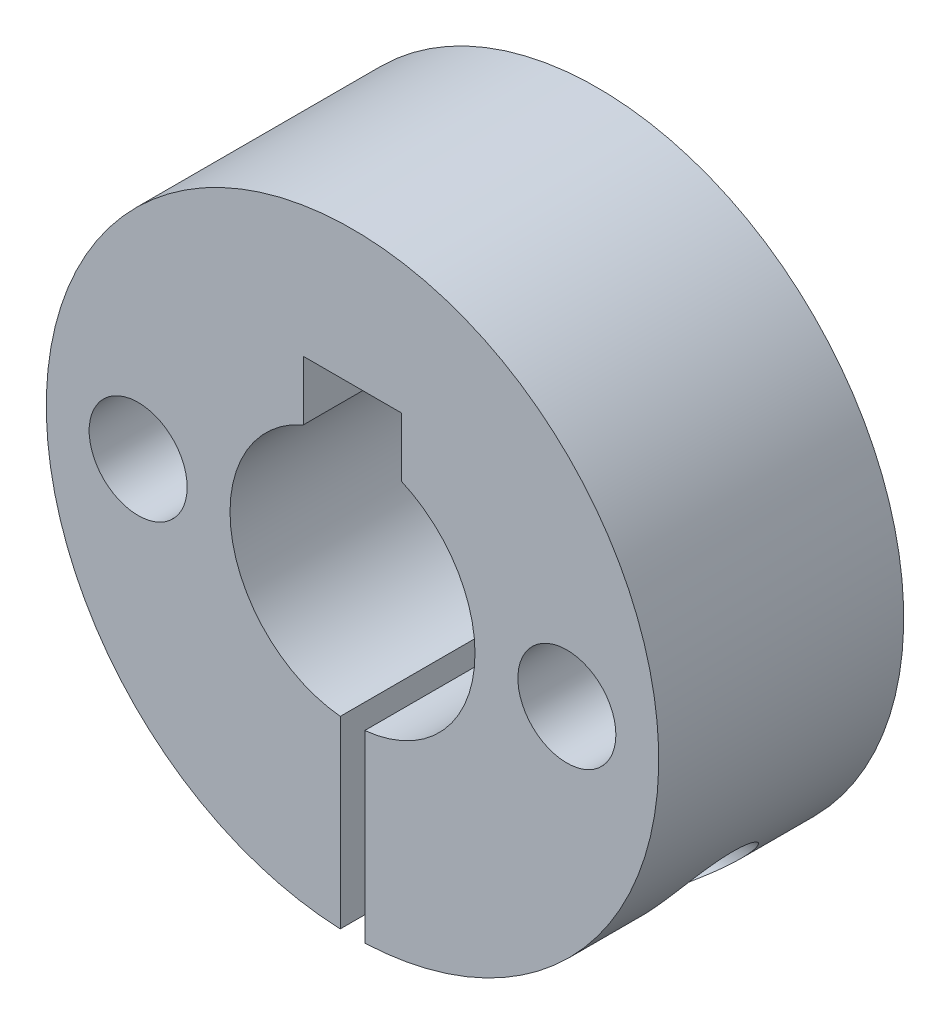
ISO-10303-21;
HEADER;
FILE_DESCRIPTION(('STEP AP214'),'2;1');
FILE_NAME('part.step','',(''),(''),'','','');
FILE_SCHEMA(('AUTOMOTIVE_DESIGN { 1 0 10303 214 1 1 1 1 }'));
ENDSEC;
DATA;
#1=APPLICATION_CONTEXT('core data for automotive mechanical design processes');
#2=APPLICATION_PROTOCOL_DEFINITION('international standard','automotive_design',2000,#1);
#3=PRODUCT_CONTEXT('',#1,'mechanical');
#4=PRODUCT('Part','Part','',(#3));
#5=PRODUCT_RELATED_PRODUCT_CATEGORY('part','',(#4));
#6=PRODUCT_DEFINITION_FORMATION('','',#4);
#7=PRODUCT_DEFINITION_CONTEXT('part definition',#1,'design');
#8=PRODUCT_DEFINITION('design','',#6,#7);
#9=PRODUCT_DEFINITION_SHAPE('','',#8);
#10=(LENGTH_UNIT() NAMED_UNIT(*) SI_UNIT(.MILLI.,.METRE.));
#11=(NAMED_UNIT(*) PLANE_ANGLE_UNIT() SI_UNIT($,.RADIAN.));
#12=(NAMED_UNIT(*) SI_UNIT($,.STERADIAN.) SOLID_ANGLE_UNIT());
#13=UNCERTAINTY_MEASURE_WITH_UNIT(LENGTH_MEASURE(1.E-05),#10,'distance_accuracy_value','');
#14=(GEOMETRIC_REPRESENTATION_CONTEXT(3) GLOBAL_UNCERTAINTY_ASSIGNED_CONTEXT((#13)) GLOBAL_UNIT_ASSIGNED_CONTEXT((#10,
#11,#12)) REPRESENTATION_CONTEXT('',''));
#15=CARTESIAN_POINT('',(0.,0.,0.));
#16=DIRECTION('',(0.,0.,1.));
#17=DIRECTION('',(1.,0.,0.));
#18=AXIS2_PLACEMENT_3D('',#15,#16,#17);
#19=CARTESIAN_POINT('',(0.,0.,10.));
#20=DIRECTION('',(0.,0.,-1.));
#21=DIRECTION('',(-1.,0.,0.));
#22=AXIS2_PLACEMENT_3D('',#19,#20,#21);
#23=CYLINDRICAL_SURFACE('',#22,10.);
#24=DIRECTION('',(0.,0.,-1.));
#25=VECTOR('',#24,1.);
#26=CARTESIAN_POINT('',(4.,9.16515138991168,10.));
#27=LINE('',#26,#25);
#28=CARTESIAN_POINT('',(4.,9.16515138991168,-10.));
#29=VERTEX_POINT('',#28);
#30=CARTESIAN_POINT('',(4.,9.16515138991168,10.));
#31=VERTEX_POINT('',#30);
#32=EDGE_CURVE('E53',#29,#31,#27,.F.);
#33=ORIENTED_EDGE('',*,*,#32,.F.);
#34=CARTESIAN_POINT('',(0.,0.,-10.));
#35=DIRECTION('',(0.,0.,1.));
#36=DIRECTION('',(1.,0.,0.));
#37=AXIS2_PLACEMENT_3D('',#34,#35,#36);
#38=CIRCLE('',#37,10.);
#39=CARTESIAN_POINT('',(1.,-9.9498743710662,-10.));
#40=VERTEX_POINT('',#39);
#41=EDGE_CURVE('E151',#40,#29,#38,.T.);
#42=ORIENTED_EDGE('',*,*,#41,.F.);
#43=DIRECTION('',(0.,0.,-1.));
#44=VECTOR('',#43,1.);
#45=CARTESIAN_POINT('',(1.,-9.9498743710662,10.));
#46=LINE('',#45,#44);
#47=CARTESIAN_POINT('',(1.,-9.9498743710662,10.));
#48=VERTEX_POINT('',#47);
#49=EDGE_CURVE('E146',#48,#40,#46,.T.);
#50=ORIENTED_EDGE('',*,*,#49,.F.);
#51=CARTESIAN_POINT('',(0.,0.,10.));
#52=DIRECTION('',(0.,0.,1.));
#53=DIRECTION('',(1.,0.,0.));
#54=AXIS2_PLACEMENT_3D('',#51,#52,#53);
#55=CIRCLE('',#54,10.);
#56=EDGE_CURVE('E207',#48,#31,#55,.T.);
#57=ORIENTED_EDGE('',*,*,#56,.T.);
#58=EDGE_LOOP('',(#33,#42,#50,#57));
#59=FACE_BOUND('',#58,.T.);
#60=ADVANCED_FACE('F39',(#59),#23,.F.);
#61=CARTESIAN_POINT('',(0.,0.,10.));
#62=DIRECTION('',(0.,0.,1.));
#63=DIRECTION('',(1.,0.,0.));
#64=AXIS2_PLACEMENT_3D('',#61,#62,#63);
#65=PLANE('',#64);
#66=DIRECTION('',(0.,1.,0.));
#67=VECTOR('',#66,1.);
#68=CARTESIAN_POINT('',(4.,0.,10.));
#69=LINE('',#68,#67);
#70=CARTESIAN_POINT('',(4.,14.,10.));
#71=VERTEX_POINT('',#70);
#72=EDGE_CURVE('E218',#31,#71,#69,.T.);
#73=ORIENTED_EDGE('',*,*,#72,.F.);
#74=ORIENTED_EDGE('',*,*,#56,.F.);
#75=DIRECTION('',(0.,1.,0.));
#76=VECTOR('',#75,1.);
#77=CARTESIAN_POINT('',(1.,0.,10.));
#78=LINE('',#77,#76);
#79=CARTESIAN_POINT('',(1.,-24.9799919935936,10.));
#80=VERTEX_POINT('',#79);
#81=EDGE_CURVE('E222',#80,#48,#78,.T.);
#82=ORIENTED_EDGE('',*,*,#81,.F.);
#83=CARTESIAN_POINT('',(0.,0.,10.));
#84=DIRECTION('',(0.,0.,1.));
#85=DIRECTION('',(1.,0.,0.));
#86=AXIS2_PLACEMENT_3D('',#83,#84,#85);
#87=CIRCLE('',#86,25.);
#88=CARTESIAN_POINT('',(-1.,-24.9799919935936,10.));
#89=VERTEX_POINT('',#88);
#90=EDGE_CURVE('E135',#80,#89,#87,.T.);
#91=ORIENTED_EDGE('',*,*,#90,.T.);
#92=DIRECTION('',(0.,-1.,0.));
#93=VECTOR('',#92,1.);
#94=CARTESIAN_POINT('',(-1.,0.,10.));
#95=LINE('',#94,#93);
#96=CARTESIAN_POINT('',(-1.,-9.9498743710662,10.));
#97=VERTEX_POINT('',#96);
#98=EDGE_CURVE('E206',#97,#89,#95,.T.);
#99=ORIENTED_EDGE('',*,*,#98,.F.);
#100=CARTESIAN_POINT('',(-4.,9.16515138991168,10.));
#101=VERTEX_POINT('',#100);
#102=EDGE_CURVE('E148',#101,#97,#55,.T.);
#103=ORIENTED_EDGE('',*,*,#102,.F.);
#104=DIRECTION('',(0.,-1.,0.));
#105=VECTOR('',#104,1.);
#106=CARTESIAN_POINT('',(-4.,0.,10.));
#107=LINE('',#106,#105);
#108=CARTESIAN_POINT('',(-4.,14.,10.));
#109=VERTEX_POINT('',#108);
#110=EDGE_CURVE('E205',#109,#101,#107,.T.);
#111=ORIENTED_EDGE('',*,*,#110,.F.);
#112=DIRECTION('',(-1.,0.,0.));
#113=VECTOR('',#112,1.);
#114=CARTESIAN_POINT('',(0.,14.,10.));
#115=LINE('',#114,#113);
#116=EDGE_CURVE('E210',#71,#109,#115,.T.);
#117=ORIENTED_EDGE('',*,*,#116,.F.);
#118=EDGE_LOOP('',(#73,#74,#82,#91,#99,#103,#111,#117));
#119=FACE_BOUND('',#118,.T.);
#120=CARTESIAN_POINT('',(17.5,0.,10.));
#121=DIRECTION('',(0.,0.,1.));
#122=DIRECTION('',(1.,0.,0.));
#123=AXIS2_PLACEMENT_3D('',#120,#121,#122);
#124=CIRCLE('',#123,4.);
#125=CARTESIAN_POINT('',(21.5,0.,10.));
#126=VERTEX_POINT('',#125);
#127=EDGE_CURVE('E212',#126,#126,#124,.T.);
#128=ORIENTED_EDGE('',*,*,#127,.F.);
#129=EDGE_LOOP('',(#128));
#130=FACE_BOUND('',#129,.T.);
#131=CARTESIAN_POINT('',(-17.5,0.,10.));
#132=DIRECTION('',(0.,0.,1.));
#133=DIRECTION('',(1.,0.,0.));
#134=AXIS2_PLACEMENT_3D('',#131,#132,#133);
#135=CIRCLE('',#134,4.);
#136=CARTESIAN_POINT('',(-13.5,0.,10.));
#137=VERTEX_POINT('',#136);
#138=EDGE_CURVE('E215',#137,#137,#135,.T.);
#139=ORIENTED_EDGE('',*,*,#138,.F.);
#140=EDGE_LOOP('',(#139));
#141=FACE_BOUND('',#140,.T.);
#142=ADVANCED_FACE('F172',(#119,#130,#141),#65,.T.);
#143=CARTESIAN_POINT('',(0.,0.,-10.));
#144=DIRECTION('',(0.,0.,1.));
#145=DIRECTION('',(1.,0.,0.));
#146=AXIS2_PLACEMENT_3D('',#143,#144,#145);
#147=PLANE('',#146);
#148=ORIENTED_EDGE('',*,*,#41,.T.);
#149=DIRECTION('',(0.,1.,0.));
#150=VECTOR('',#149,1.);
#151=CARTESIAN_POINT('',(4.,14.,-10.));
#152=LINE('',#151,#150);
#153=CARTESIAN_POINT('',(4.,14.,-10.));
#154=VERTEX_POINT('',#153);
#155=EDGE_CURVE('E236',#29,#154,#152,.T.);
#156=ORIENTED_EDGE('',*,*,#155,.T.);
#157=DIRECTION('',(-1.,0.,0.));
#158=VECTOR('',#157,1.);
#159=CARTESIAN_POINT('',(-4.,14.,-10.));
#160=LINE('',#159,#158);
#161=CARTESIAN_POINT('',(-4.,14.,-10.));
#162=VERTEX_POINT('',#161);
#163=EDGE_CURVE('E245',#154,#162,#160,.T.);
#164=ORIENTED_EDGE('',*,*,#163,.T.);
#165=DIRECTION('',(0.,-1.,0.));
#166=VECTOR('',#165,1.);
#167=CARTESIAN_POINT('',(-4.,14.,-10.));
#168=LINE('',#167,#166);
#169=CARTESIAN_POINT('',(-4.,9.16515138991168,-10.));
#170=VERTEX_POINT('',#169);
#171=EDGE_CURVE('E241',#162,#170,#168,.T.);
#172=ORIENTED_EDGE('',*,*,#171,.T.);
#173=CARTESIAN_POINT('',(-1.,-9.9498743710662,-10.));
#174=VERTEX_POINT('',#173);
#175=EDGE_CURVE('E197',#170,#174,#38,.T.);
#176=ORIENTED_EDGE('',*,*,#175,.T.);
#177=DIRECTION('',(0.,-1.,0.));
#178=VECTOR('',#177,1.);
#179=CARTESIAN_POINT('',(-1.,-27.5,-10.));
#180=LINE('',#179,#178);
#181=CARTESIAN_POINT('',(-1.,-24.9799919935936,-10.));
#182=VERTEX_POINT('',#181);
#183=EDGE_CURVE('E67',#174,#182,#180,.T.);
#184=ORIENTED_EDGE('',*,*,#183,.T.);
#185=CARTESIAN_POINT('',(0.,0.,-10.));
#186=DIRECTION('',(0.,0.,1.));
#187=DIRECTION('',(1.,0.,0.));
#188=AXIS2_PLACEMENT_3D('',#185,#186,#187);
#189=CIRCLE('',#188,25.);
#190=CARTESIAN_POINT('',(1.,-24.9799919935936,-10.));
#191=VERTEX_POINT('',#190);
#192=EDGE_CURVE('E144',#191,#182,#189,.T.);
#193=ORIENTED_EDGE('',*,*,#192,.F.);
#194=DIRECTION('',(0.,1.,0.));
#195=VECTOR('',#194,1.);
#196=CARTESIAN_POINT('',(1.,-27.5,-10.));
#197=LINE('',#196,#195);
#198=EDGE_CURVE('E233',#191,#40,#197,.T.);
#199=ORIENTED_EDGE('',*,*,#198,.T.);
#200=EDGE_LOOP('',(#148,#156,#164,#172,#176,#184,#193,#199));
#201=FACE_BOUND('',#200,.T.);
#202=CARTESIAN_POINT('',(17.5,0.,-10.));
#203=DIRECTION('',(0.,0.,1.));
#204=DIRECTION('',(1.,0.,0.));
#205=AXIS2_PLACEMENT_3D('',#202,#203,#204);
#206=CIRCLE('',#205,4.);
#207=CARTESIAN_POINT('',(21.5,0.,-10.));
#208=VERTEX_POINT('',#207);
#209=EDGE_CURVE('E230',#208,#208,#206,.T.);
#210=ORIENTED_EDGE('',*,*,#209,.T.);
#211=EDGE_LOOP('',(#210));
#212=FACE_BOUND('',#211,.T.);
#213=CARTESIAN_POINT('',(-17.5,0.,-10.));
#214=DIRECTION('',(0.,0.,1.));
#215=DIRECTION('',(1.,0.,0.));
#216=AXIS2_PLACEMENT_3D('',#213,#214,#215);
#217=CIRCLE('',#216,4.);
#218=CARTESIAN_POINT('',(-13.5,0.,-10.));
#219=VERTEX_POINT('',#218);
#220=EDGE_CURVE('E227',#219,#219,#217,.T.);
#221=ORIENTED_EDGE('',*,*,#220,.T.);
#222=EDGE_LOOP('',(#221));
#223=FACE_BOUND('',#222,.T.);
#224=ADVANCED_FACE('F126',(#201,#212,#223),#147,.F.);
#225=CARTESIAN_POINT('',(0.,0.,10.));
#226=DIRECTION('',(0.,0.,-1.));
#227=DIRECTION('',(-1.,0.,0.));
#228=AXIS2_PLACEMENT_3D('',#225,#226,#227);
#229=CYLINDRICAL_SURFACE('',#228,25.);
#230=DIRECTION('',(0.,0.,-1.));
#231=VECTOR('',#230,1.);
#232=CARTESIAN_POINT('',(-7.,-24.,10.));
#233=LINE('',#232,#231);
#234=CARTESIAN_POINT('',(-7.,-24.,1.68979338636032));
#235=VERTEX_POINT('',#234);
#236=CARTESIAN_POINT('',(-7.,-24.,-1.68979338636032));
#237=VERTEX_POINT('',#236);
#238=EDGE_CURVE('E114',#235,#237,#233,.T.);
#239=ORIENTED_EDGE('',*,*,#238,.T.);
#240=CARTESIAN_POINT('',(-7.,-24.,-1.68979338636032));
#241=CARTESIAN_POINT('',(-7.04698646679375,-23.9862965094227,-1.74277770727299));
#242=CARTESIAN_POINT('',(-7.09492338259064,-23.9721642533068,-1.79478687769973));
#243=CARTESIAN_POINT('',(-7.19239750146819,-23.9430990974332,-1.89702366944836));
#244=CARTESIAN_POINT('',(-7.24193421412975,-23.9281664421296,-1.94725182701945));
#245=CARTESIAN_POINT('',(-7.39241292197711,-23.8822781585142,-2.09544265605817));
#246=CARTESIAN_POINT('',(-7.49534118769952,-23.8501980367908,-2.19104189080603));
#247=CARTESIAN_POINT('',(-7.70455852734334,-23.7834355502832,-2.3767035615796));
#248=CARTESIAN_POINT('',(-7.81083496840963,-23.7487624152619,-2.46678373715356));
#249=CARTESIAN_POINT('',(-8.0261316781046,-23.6768687081174,-2.64260596078345));
#250=CARTESIAN_POINT('',(-8.13515292599585,-23.6396472184375,-2.72834642675844));
#251=CARTESIAN_POINT('',(-8.46515237265526,-23.5243573511826,-2.97993319701339));
#252=CARTESIAN_POINT('',(-8.68912378556757,-23.4426453630521,-3.14019441234509));
#253=CARTESIAN_POINT('',(-9.14176692476632,-23.2698726258485,-3.44912425850699));
#254=CARTESIAN_POINT('',(-9.37044423282278,-23.1788001940038,-3.59777798486973));
#255=CARTESIAN_POINT('',(-9.81581425134836,-22.9935695796321,-3.87592507987069));
#256=CARTESIAN_POINT('',(-10.0323539860139,-22.8999675991278,-4.0060355541673));
#257=CARTESIAN_POINT('',(-10.4665818888861,-22.7047868460749,-4.25815009720803));
#258=CARTESIAN_POINT('',(-10.6842701797208,-22.6032072050131,-4.38015328064964));
#259=CARTESIAN_POINT('',(-11.119994074826,-22.3920598832454,-4.61638540338937));
#260=CARTESIAN_POINT('',(-11.3380296836767,-22.2824920963264,-4.73061423927802));
#261=CARTESIAN_POINT('',(-11.7738443546135,-22.0553165825155,-4.95135980611353));
#262=CARTESIAN_POINT('',(-11.9916233921792,-21.9377081420078,-5.0578758508108));
#263=CARTESIAN_POINT('',(-12.4269212623975,-21.6940999485575,-5.26327768645734));
#264=CARTESIAN_POINT('',(-12.6444381438987,-21.5680803050142,-5.36214410445487));
#265=CARTESIAN_POINT('',(-13.0781856196315,-21.3078643112042,-5.55160137633513));
#266=CARTESIAN_POINT('',(-13.2944160595556,-21.1736670009056,-5.64219125544652));
#267=CARTESIAN_POINT('',(-13.9402517407571,-20.758873001547,-5.90073460107318));
#268=CARTESIAN_POINT('',(-14.367365678789,-20.4658714068908,-6.05563445283083));
#269=CARTESIAN_POINT('',(-15.0640995010432,-19.9546880030704,-6.27789988807799));
#270=CARTESIAN_POINT('',(-15.3369178108521,-19.7458456329709,-6.35698512484009));
#271=CARTESIAN_POINT('',(-15.8767199453893,-19.3144771771857,-6.49561498377549));
#272=CARTESIAN_POINT('',(-16.1437041108821,-19.0919518936116,-6.55516075008584));
#273=CARTESIAN_POINT('',(-16.6696821155704,-18.6344537819038,-6.65201034370646));
#274=CARTESIAN_POINT('',(-16.9286961183453,-18.3995173068086,-6.68937559000457));
#275=CARTESIAN_POINT('',(-17.4378686747237,-17.9176855643757,-6.73914992257482));
#276=CARTESIAN_POINT('',(-17.6880295625872,-17.6707934905933,-6.75156563606745));
#277=CARTESIAN_POINT('',(-18.1184664430586,-17.2276592122496,-6.74853520943895));
#278=CARTESIAN_POINT('',(-18.3010274499598,-17.0335873844912,-6.73909455670127));
#279=CARTESIAN_POINT('',(-18.6590346009024,-16.640643315278,-6.70238523855615));
#280=CARTESIAN_POINT('',(-18.8344824004623,-16.4417722081898,-6.6751207470363));
#281=CARTESIAN_POINT('',(-19.1772012541084,-16.0407139305507,-6.60118634630128));
#282=CARTESIAN_POINT('',(-19.3444754949759,-15.838528094109,-6.55452406863702));
#283=CARTESIAN_POINT('',(-19.6698001766335,-15.4326454342627,-6.44024282978332));
#284=CARTESIAN_POINT('',(-19.8278524951624,-15.2289489280436,-6.3726281526753));
#285=CARTESIAN_POINT('',(-20.1035489349646,-14.8623396823497,-6.23054587144241));
#286=CARTESIAN_POINT('',(-20.2230329670911,-14.6992736694215,-6.16003183847775));
#287=CARTESIAN_POINT('',(-20.4546941669554,-14.3751569392773,-6.00400828458569));
#288=CARTESIAN_POINT('',(-20.5668729448714,-14.2141057843248,-5.91850208358435));
#289=CARTESIAN_POINT('',(-20.7833363171647,-13.8956824394506,-5.73210022511371));
#290=CARTESIAN_POINT('',(-20.8876227089,-13.7383094175728,-5.63120808740792));
#291=CARTESIAN_POINT('',(-21.0877920814576,-13.4290340885278,-5.41384686360637));
#292=CARTESIAN_POINT('',(-21.1836749256002,-13.2771318703644,-5.29737752423258));
#293=CARTESIAN_POINT('',(-21.3672376171975,-12.9796737905324,-5.0480572177177));
#294=CARTESIAN_POINT('',(-21.4548514417265,-12.8341732727793,-4.9150912974575));
#295=CARTESIAN_POINT('',(-21.6206711591483,-12.5528185274293,-4.63391624506733));
#296=CARTESIAN_POINT('',(-21.6988768033438,-12.4169645548697,-4.48570671017716));
#297=CARTESIAN_POINT('',(-21.845558521506,-12.1570492042689,-4.17491202164075));
#298=CARTESIAN_POINT('',(-21.9140378736752,-12.0329838576141,-4.01233174170501));
#299=CARTESIAN_POINT('',(-22.0411054720338,-11.7986206512066,-3.67392767259866));
#300=CARTESIAN_POINT('',(-22.099695150825,-11.6883207980116,-3.49810580692785));
#301=CARTESIAN_POINT('',(-22.200166642127,-11.4962096892875,-3.15755092657899));
#302=CARTESIAN_POINT('',(-22.243222591943,-11.4125603242383,-2.99419718892482));
#303=CARTESIAN_POINT('',(-22.3217036220905,-11.2582877311904,-2.65969263096929));
#304=CARTESIAN_POINT('',(-22.3571293064322,-11.1876634721907,-2.48854242913469));
#305=CARTESIAN_POINT('',(-22.42036256713,-11.0603976008472,-2.13982818560168));
#306=CARTESIAN_POINT('',(-22.4481728398302,-11.0037510402063,-1.96226643927002));
#307=CARTESIAN_POINT('',(-22.4962322374338,-10.9051615812551,-1.60210778601371));
#308=CARTESIAN_POINT('',(-22.5164816442008,-10.8632181348268,-1.41951106706177));
#309=CARTESIAN_POINT('',(-22.5482975648633,-10.7970146134131,-1.06383301812547));
#310=CARTESIAN_POINT('',(-22.5603761286355,-10.7717152183192,-0.890989940008522));
#311=CARTESIAN_POINT('',(-22.5780670581107,-10.7345849443248,-0.543538003399057));
#312=CARTESIAN_POINT('',(-22.5836796985714,-10.7227534931287,-0.368929220255069));
#313=CARTESIAN_POINT('',(-22.5884525968365,-10.7126952748873,-0.0192636800331903));
#314=CARTESIAN_POINT('',(-22.5876139762293,-10.7144661430013,0.155792993886194));
#315=CARTESIAN_POINT('',(-22.5794849400438,-10.7315865355046,0.505091623187189));
#316=CARTESIAN_POINT('',(-22.5721945178052,-10.746936073911,0.679333577727585));
#317=CARTESIAN_POINT('',(-22.5513446433342,-10.7906174992242,1.02242111789398));
#318=CARTESIAN_POINT('',(-22.5379069963474,-10.8186970521866,1.19130632159875));
#319=CARTESIAN_POINT('',(-22.5047727789135,-10.8874541189939,1.52592691914697));
#320=CARTESIAN_POINT('',(-22.4850741021654,-10.9281358722843,1.6916612330712));
#321=CARTESIAN_POINT('',(-22.4393923505876,-11.0216320977258,2.0187357358383));
#322=CARTESIAN_POINT('',(-22.4134108633136,-11.0744435047578,2.1800770232814));
#323=CARTESIAN_POINT('',(-22.3551303370565,-11.19162302705,2.49733399068357));
#324=CARTESIAN_POINT('',(-22.3228310507722,-11.2559915946904,2.65324945797529));
#325=CARTESIAN_POINT('',(-22.2515594470957,-11.3962425605698,2.96010514443894));
#326=CARTESIAN_POINT('',(-22.2125263969528,-11.4722289622396,3.11098369434354));
#327=CARTESIAN_POINT('',(-22.1280085724091,-11.6344142087679,3.4052570404025));
#328=CARTESIAN_POINT('',(-22.0825236536381,-11.7206132821431,3.54865166899468));
#329=CARTESIAN_POINT('',(-21.9851456918683,-11.9022679658472,3.82712541357725));
#330=CARTESIAN_POINT('',(-21.9332535174357,-11.9977223211563,3.96220565295239));
#331=CARTESIAN_POINT('',(-21.8231133382675,-12.1969126128678,4.22344069512534));
#332=CARTESIAN_POINT('',(-21.7648631034783,-12.3006514515601,4.34959234052995));
#333=CARTESIAN_POINT('',(-21.6394674606011,-12.5199874740566,4.59767373362377));
#334=CARTESIAN_POINT('',(-21.5720452808138,-12.6359042372485,4.71918089720109));
#335=CARTESIAN_POINT('',(-21.4305869775793,-12.8743607330125,4.95145039436055));
#336=CARTESIAN_POINT('',(-21.3565484453962,-12.9969028711397,5.06220878390337));
#337=CARTESIAN_POINT('',(-21.2021311994866,-13.2473114795851,5.27265691882895));
#338=CARTESIAN_POINT('',(-21.1217537812741,-13.3751768594533,5.37234891593734));
#339=CARTESIAN_POINT('',(-20.9549003462745,-13.635102247524,5.56063501685828));
#340=CARTESIAN_POINT('',(-20.8684221165842,-13.7671637681168,5.64922506105466));
#341=CARTESIAN_POINT('',(-20.6807074619542,-14.0477619109671,5.82369389434595));
#342=CARTESIAN_POINT('',(-20.5788617249292,-14.1966187634687,5.90840203676102));
#343=CARTESIAN_POINT('',(-20.368617338138,-14.4966549847893,6.06468914921972));
#344=CARTESIAN_POINT('',(-20.2602160681775,-14.6478352640148,6.13626282278888));
#345=CARTESIAN_POINT('',(-20.0373377384078,-14.9512721079971,6.26668072230069));
#346=CARTESIAN_POINT('',(-19.9228587313876,-15.1035290039764,6.32552083758754));
#347=CARTESIAN_POINT('',(-19.6883319498517,-15.4080027967888,6.43098023781373));
#348=CARTESIAN_POINT('',(-19.5682830108517,-15.5602196785058,6.47759695358059));
#349=CARTESIAN_POINT('',(-19.2617374379052,-15.9396050218748,6.57962276791933));
#350=CARTESIAN_POINT('',(-19.0720445551709,-16.1661729079169,6.62776304034069));
#351=CARTESIAN_POINT('',(-18.6827302356047,-16.6145680932092,6.70007475180991));
#352=CARTESIAN_POINT('',(-18.4831049443731,-16.8363935035805,6.72423680840594));
#353=CARTESIAN_POINT('',(-18.0751045348272,-17.2736830105818,6.75084926461891));
#354=CARTESIAN_POINT('',(-17.8667183228338,-17.4891384151678,6.75327124935841));
#355=CARTESIAN_POINT('',(-17.4427258418557,-17.9120360396689,6.73849915649642));
#356=CARTESIAN_POINT('',(-17.2271195131335,-18.1194781932536,6.72130491655574));
#357=CARTESIAN_POINT('',(-16.7008643255373,-18.6079847678218,6.65873912255971));
#358=CARTESIAN_POINT('',(-16.3871955672289,-18.8847131009499,6.60475689803956));
#359=CARTESIAN_POINT('',(-15.7503061013149,-19.4190854922576,6.46683754840535));
#360=CARTESIAN_POINT('',(-15.4270813514825,-19.6767213078401,6.38288757558705));
#361=CARTESIAN_POINT('',(-14.7724286238584,-20.1728658748174,6.1887609893709));
#362=CARTESIAN_POINT('',(-14.4409796806436,-20.4113173347973,6.07850945396689));
#363=CARTESIAN_POINT('',(-13.7727688825992,-20.8680284934799,5.83510085283947));
#364=CARTESIAN_POINT('',(-13.436007701433,-21.0862907287331,5.70194667060525));
#365=CARTESIAN_POINT('',(-12.7458653776031,-21.5107720545756,5.40949765872622));
#366=CARTESIAN_POINT('',(-12.3923440835797,-21.7162022546255,5.24939284095943));
#367=CARTESIAN_POINT('',(-11.6834182092581,-22.1056834875251,4.90846084057705));
#368=CARTESIAN_POINT('',(-11.3280133451275,-22.2897311966345,4.72763044498856));
#369=CARTESIAN_POINT('',(-10.7963515626445,-22.5494456025887,4.4414727741142));
#370=CARTESIAN_POINT('',(-10.6197892224094,-22.6331115425434,4.34385075259709));
#371=CARTESIAN_POINT('',(-10.2672486467873,-22.7952017549466,4.14335208456196));
#372=CARTESIAN_POINT('',(-10.0912703683202,-22.8736264225383,4.04047583519797));
#373=CARTESIAN_POINT('',(-9.74040355048426,-23.0252266086453,3.82917037727579));
#374=CARTESIAN_POINT('',(-9.56551495095936,-23.0984024193123,3.72074147835513));
#375=CARTESIAN_POINT('',(-9.21750436140776,-23.2394674661436,3.49780793824128));
#376=CARTESIAN_POINT('',(-9.04438216719163,-23.3073573195,3.38330400900598));
#377=CARTESIAN_POINT('',(-8.70683145954863,-23.4354972747588,3.15147455971839));
#378=CARTESIAN_POINT('',(-8.54231016156312,-23.4959311072993,3.03438621345413));
#379=CARTESIAN_POINT('',(-8.21719622066791,-23.6115942567866,2.79267318672312));
#380=CARTESIAN_POINT('',(-8.0566002493192,-23.6668281049849,2.66805522598443));
#381=CARTESIAN_POINT('',(-7.81987320530655,-23.7456639140046,2.47382470140341));
#382=CARTESIAN_POINT('',(-7.74152394964689,-23.7713151068427,2.40774066824902));
#383=CARTESIAN_POINT('',(-7.58673396426428,-23.8211686415258,2.27287051068693));
#384=CARTESIAN_POINT('',(-7.51029285082628,-23.8453712760572,2.20408493681884));
#385=CARTESIAN_POINT('',(-7.35962994615552,-23.8923014359018,2.06324404949516));
#386=CARTESIAN_POINT('',(-7.28541392029243,-23.9150252823484,1.99118128635215));
#387=CARTESIAN_POINT('',(-7.14013136215484,-23.9588051826613,1.8433712686024));
#388=CARTESIAN_POINT('',(-7.06906705231876,-23.9798600676415,1.76762149062544));
#389=CARTESIAN_POINT('',(-6.99999999999954,-24.0000000000002,1.6897933863611));
#390=B_SPLINE_CURVE_WITH_KNOTS('',3,(#240,#241,#242,#243,#244,#245,#246,#247,#248,#249,#250,
#251,#252,#253,#254,#255,#256,#257,#258,#259,#260,#261,#262,#263,#264,#265,#266,#267,#268,#269,
#270,#271,#272,#273,#274,#275,#276,#277,#278,#279,#280,#281,#282,#283,#284,#285,#286,#287,#288,
#289,#290,#291,#292,#293,#294,#295,#296,#297,#298,#299,#300,#301,#302,#303,#304,#305,#306,#307,
#308,#309,#310,#311,#312,#313,#314,#315,#316,#317,#318,#319,#320,#321,#322,#323,#324,#325,#326,
#327,#328,#329,#330,#331,#332,#333,#334,#335,#336,#337,#338,#339,#340,#341,#342,#343,#344,#345,
#346,#347,#348,#349,#350,#351,#352,#353,#354,#355,#356,#357,#358,#359,#360,#361,#362,#363,#364,
#365,#366,#367,#368,#369,#370,#371,#372,#373,#374,#375,#376,#377,#378,#379,#380,#381,#382,#383,
#384,#385,#386,#387,#388,#389),.UNSPECIFIED.,.F.,.F.,(4,2,2,2,2,2,2,2,2,2,2,2,2,2,2,2,2,2,2,2,2,
2,2,2,2,2,2,2,2,2,2,2,2,2,2,2,2,2,2,2,2,2,2,2,2,2,2,2,2,2,2,2,2,2,2,2,2,2,2,2,2,2,2,2,2,2,2,2,2,
2,2,2,2,2,4),(0.,0.216354007528023,0.432642309611873,0.864683484095324,1.29525398914836,
1.7259803484346,2.58719943114143,3.44950676399272,4.25746900248717,5.06551932460315,
5.87358039279492,6.68171327051631,7.49182998598781,8.30204199048507,9.92111641603074,
10.9780965443251,12.0350147699169,13.0889925154138,14.1426902610099,14.9418736362618,
15.7408699301942,16.5395521770108,17.3380712270241,17.9797716979385,18.6213302471748,
19.2627422498395,19.9041646828327,20.5503383215152,21.1965290375067,21.8425014383809,
22.4883801843034,23.0531681323458,23.6179113554524,24.1824543639489,24.7469763245895,
25.2716461393014,25.7962936582963,26.3208499663977,26.845406815995,27.3599921305911,
27.8747507426821,28.3893794199922,28.9040282457291,29.4235878106405,29.9431590033081,
30.4626598401845,30.9823434781522,31.524640914602,32.0671365893866,32.6095216771631,
33.1521045220339,33.7493063657455,34.3467485044316,34.9443832230349,35.5421434548498,
36.4389550310869,37.3361173831157,38.2344521807707,39.132794412884,40.396174046572,
41.6600959652557,42.9276621816603,44.1950689255947,45.5113459310089,46.8278272683534,
47.4829655603412,48.1380544051318,48.7931067592936,49.448082514015,50.0802460846937,
50.7118535897878,51.0287792799972,51.3456407165357,51.6632624607035,51.9811047266217),.UNSPECIFIED.);
#391=EDGE_CURVE('E11',#237,#235,#390,.T.);
#392=ORIENTED_EDGE('',*,*,#391,.T.);
#393=EDGE_LOOP('',(#239,#392));
#394=FACE_BOUND('',#393,.T.);
#395=CARTESIAN_POINT('',(17.8878760320154,-17.4649331823299,-4.));
#396=CARTESIAN_POINT('',(17.729007624613,-17.627648671415,-4.00000122172489));
#397=CARTESIAN_POINT('',(17.5679130774947,-17.7881916430074,-3.99008238074177));
#398=CARTESIAN_POINT('',(17.2424677151876,-18.1038323890283,-3.95184765168596));
#399=CARTESIAN_POINT('',(17.0781149159707,-18.258926675704,-3.92352019837831));
#400=CARTESIAN_POINT('',(16.7465859413994,-18.5634797255851,-3.84940028552092));
#401=CARTESIAN_POINT('',(16.5793997313894,-18.7129062712356,-3.80352082062567));
#402=CARTESIAN_POINT('',(16.2442522089753,-19.0045681047078,-3.69509515675879));
#403=CARTESIAN_POINT('',(16.0762910964146,-19.1468051446529,-3.63255304209652));
#404=CARTESIAN_POINT('',(15.7377935653492,-19.4260354617996,-3.48985855146519));
#405=CARTESIAN_POINT('',(15.5672657946038,-19.5628865332155,-3.40940689355334));
#406=CARTESIAN_POINT('',(15.2282358127687,-19.8279382962388,-3.23136486852235));
#407=CARTESIAN_POINT('',(15.0597347401663,-19.9561342968093,-3.13376530886729));
#408=CARTESIAN_POINT('',(14.7279484239529,-20.2022263908849,-2.92122005716067));
#409=CARTESIAN_POINT('',(14.5646394360237,-20.3201756648892,-2.80637356932353));
#410=CARTESIAN_POINT('',(14.2455383541521,-20.5451354932146,-2.55743991045744));
#411=CARTESIAN_POINT('',(14.0897361642934,-20.6521609688279,-2.42337960331837));
#412=CARTESIAN_POINT('',(13.826759491495,-20.8288123198174,-2.16844483902907));
#413=CARTESIAN_POINT('',(13.7169498730199,-20.9012165553779,-2.0522466560833));
#414=CARTESIAN_POINT('',(13.5077604107311,-21.0370136163063,-1.80558134247568));
#415=CARTESIAN_POINT('',(13.4083923185945,-21.1003963160016,-1.6750984648244));
#416=CARTESIAN_POINT('',(13.2241826119422,-21.2163374196727,-1.39641460014884));
#417=CARTESIAN_POINT('',(13.1395567269289,-21.2687370427025,-1.24799695344703));
#418=CARTESIAN_POINT('',(13.0311325065058,-21.3352153507869,-1.01364946409737));
#419=CARTESIAN_POINT('',(12.9981030033613,-21.3553391347787,-0.933674312925865));
#420=CARTESIAN_POINT('',(12.9393503172954,-21.390988371336,-0.77012591705878));
#421=CARTESIAN_POINT('',(12.9136222958156,-21.4065168694067,-0.68655509763757));
#422=CARTESIAN_POINT('',(12.8634042035499,-21.4367438873448,-0.487755579947779));
#423=CARTESIAN_POINT('',(12.842240843181,-21.4494066787213,-0.371332808479139));
#424=CARTESIAN_POINT('',(12.8172424589905,-21.464354711324,-0.136033179596097));
#425=CARTESIAN_POINT('',(12.8133940604628,-21.4666479623671,-0.017158287621152));
#426=CARTESIAN_POINT('',(12.8234228260632,-21.4606582648994,0.219533295653164));
#427=CARTESIAN_POINT('',(12.8372969057933,-21.4523771567369,0.337350167495684));
#428=CARTESIAN_POINT('',(12.8812607111423,-21.4260066055264,0.568779659200297));
#429=CARTESIAN_POINT('',(12.9113661980281,-21.4079076288782,0.682388077721619));
#430=CARTESIAN_POINT('',(12.9986471682496,-21.3550604295606,0.943716797692047));
#431=CARTESIAN_POINT('',(13.0616969095564,-21.3166434210743,1.08870887567442));
#432=CARTESIAN_POINT('',(13.205988607045,-21.2275535679717,1.36526132253326));
#433=CARTESIAN_POINT('',(13.2872750584293,-21.1768507228709,1.49678767394962));
#434=CARTESIAN_POINT('',(13.4462587315093,-21.0761789365026,1.72375829099645));
#435=CARTESIAN_POINT('',(13.5218826082836,-21.0277791091193,1.82139720974247));
#436=CARTESIAN_POINT('',(13.6793467292386,-20.9256846636852,2.00862621880331));
#437=CARTESIAN_POINT('',(13.7611909652152,-20.8719866389142,2.09821105869867));
#438=CARTESIAN_POINT('',(13.9295910244361,-20.7599793589967,2.27006783966242));
#439=CARTESIAN_POINT('',(14.0161549939882,-20.7016620469994,2.35232644712525));
#440=CARTESIAN_POINT('',(14.1927156787458,-20.5810173159559,2.50995357449373));
#441=CARTESIAN_POINT('',(14.2827135178189,-20.5186885793506,2.58531981070791));
#442=CARTESIAN_POINT('',(14.5244289279699,-20.3488256603724,2.77642263070451));
#443=CARTESIAN_POINT('',(14.678333015848,-20.2381817171118,2.88665444362673));
#444=CARTESIAN_POINT('',(14.9902711498068,-20.0082333648724,3.09116369682668));
#445=CARTESIAN_POINT('',(15.1483076155257,-19.8889238057818,3.18543153674916));
#446=CARTESIAN_POINT('',(15.4667335950946,-19.6423201881533,3.3588273151111));
#447=CARTESIAN_POINT('',(15.6271253601041,-19.5150180505475,3.4379395958829));
#448=CARTESIAN_POINT('',(15.9486226185316,-19.2531665804923,3.58112821185722));
#449=CARTESIAN_POINT('',(16.1097279547861,-19.1186187775039,3.64520770509788));
#450=CARTESIAN_POINT('',(16.4370014255816,-18.8380730988611,3.76008451810343));
#451=CARTESIAN_POINT('',(16.6031547814531,-18.6918411966016,3.81035414972336));
#452=CARTESIAN_POINT('',(16.9338422961458,-18.3927894072336,3.89399469203821));
#453=CARTESIAN_POINT('',(17.0983761850119,-18.2399684438712,3.92736283061844));
#454=CARTESIAN_POINT('',(17.4244007438566,-17.9287732181493,3.97612931551504));
#455=CARTESIAN_POINT('',(17.5858958067054,-17.7704081003272,3.99155593772163));
#456=CARTESIAN_POINT('',(17.904778303785,-17.4490758694719,4.00319994541051));
#457=CARTESIAN_POINT('',(18.0621672894796,-17.2861105445234,3.99942469507558));
#458=CARTESIAN_POINT('',(18.441791901457,-16.8821649135709,3.96459028477786));
#459=CARTESIAN_POINT('',(18.6611645326626,-16.6392328430571,3.92196440319479));
#460=CARTESIAN_POINT('',(18.9778051602232,-16.2747976031502,3.82092377238648));
#461=CARTESIAN_POINT('',(19.0812696875066,-16.1533287755468,3.78106751009868));
#462=CARTESIAN_POINT('',(19.283436415671,-15.9114388929013,3.68828383121779));
#463=CARTESIAN_POINT('',(19.3821396049305,-15.7910176246939,3.63535914150235));
#464=CARTESIAN_POINT('',(19.6311775816864,-15.4814817765848,3.4801130574509));
#465=CARTESIAN_POINT('',(19.7772893462695,-15.2941273000006,3.36713737531834));
#466=CARTESIAN_POINT('',(20.0516184703561,-14.9326505984684,3.10441259487418));
#467=CARTESIAN_POINT('',(20.179855406701,-14.7585139938287,2.95470423106048));
#468=CARTESIAN_POINT('',(20.3957496081773,-14.4582839528893,2.64550039244652));
#469=CARTESIAN_POINT('',(20.4866164845309,-14.3289655307498,2.49143330600621));
#470=CARTESIAN_POINT('',(20.6095527526549,-14.151027279795,2.24242794497509));
#471=CARTESIAN_POINT('',(20.6483180406888,-14.0943667255711,2.15640094467982));
#472=CARTESIAN_POINT('',(20.7211209435952,-13.9871132592191,1.97876579999012));
#473=CARTESIAN_POINT('',(20.7551605605247,-13.9365177788368,1.88716004287693));
#474=CARTESIAN_POINT('',(20.8184443764565,-13.8418078140054,1.69829181905166));
#475=CARTESIAN_POINT('',(20.8476575814323,-13.7977353938863,1.60099784197332));
#476=CARTESIAN_POINT('',(20.9007758345232,-13.7171388983276,1.40198277244736));
#477=CARTESIAN_POINT('',(20.924683355949,-13.6806113063245,1.3002637693423));
#478=CARTESIAN_POINT('',(20.9669944278181,-13.615676581602,1.09316048047438));
#479=CARTESIAN_POINT('',(20.9853985013317,-13.5872686771655,0.987776544105315));
#480=CARTESIAN_POINT('',(21.0165372239402,-13.5390542460073,0.774242115722782));
#481=CARTESIAN_POINT('',(21.0292724831362,-13.5192467936751,0.666091922750733));
#482=CARTESIAN_POINT('',(21.0479405315298,-13.4901617352926,0.459286320488142));
#483=CARTESIAN_POINT('',(21.0544400931735,-13.4800077996305,0.36080407829779));
#484=CARTESIAN_POINT('',(21.062741383633,-13.4670333079379,0.163124270520924));
#485=CARTESIAN_POINT('',(21.0645415835956,-13.4642151384682,0.0639264826666085));
#486=CARTESIAN_POINT('',(21.0634256401588,-13.4659608315898,-0.134308261098226));
#487=CARTESIAN_POINT('',(21.0605127420734,-13.4705196146078,-0.233345280713262));
#488=CARTESIAN_POINT('',(21.0499975355102,-13.4869454769841,-0.430595939029571));
#489=CARTESIAN_POINT('',(21.0423935038021,-13.4988152419392,-0.528809261712069));
#490=CARTESIAN_POINT('',(21.0229697079518,-13.529044801027,-0.719515115059196));
#491=CARTESIAN_POINT('',(21.0113416160167,-13.5471092280789,-0.812074040842231));
#492=CARTESIAN_POINT('',(20.9839164866516,-13.5895504205866,-0.99511413221629));
#493=CARTESIAN_POINT('',(20.9681180028088,-13.613929376049,-1.08559456506749));
#494=CARTESIAN_POINT('',(20.9146198854309,-13.6960940611058,-1.35296686587162));
#495=CARTESIAN_POINT('',(20.8707988951619,-13.7629372045344,-1.52597223927871));
#496=CARTESIAN_POINT('',(20.7661656926987,-13.9203282473183,-1.86324924501893));
#497=CARTESIAN_POINT('',(20.7048027814045,-14.0116371634963,-2.02698864714352));
#498=CARTESIAN_POINT('',(20.5673568204985,-14.2126226468408,-2.33590497407358));
#499=CARTESIAN_POINT('',(20.4912702135296,-14.3223036519815,-2.4810773988488));
#500=CARTESIAN_POINT('',(20.3174540582792,-14.5679754792915,-2.76522915089072));
#501=CARTESIAN_POINT('',(20.218295223423,-14.7055170345637,-2.90198558452767));
#502=CARTESIAN_POINT('',(20.006409011142,-14.9925160557717,-3.15011493624591));
#503=CARTESIAN_POINT('',(19.8936698313702,-15.1419838478712,-3.26146552797017));
#504=CARTESIAN_POINT('',(19.6044896060544,-15.5158445764683,-3.50286325769598));
#505=CARTESIAN_POINT('',(19.4218963229055,-15.7441875205417,-3.61946740765925));
#506=CARTESIAN_POINT('',(19.0389609721842,-16.2051858155137,-3.80459223554986));
#507=CARTESIAN_POINT('',(18.8386036306586,-16.4378447387956,-3.87307107371859));
#508=CARTESIAN_POINT('',(18.5116597938797,-16.8033092024129,-3.94728555507324));
#509=CARTESIAN_POINT('',(18.3892472968469,-16.9371993539963,-3.96728313162128));
#510=CARTESIAN_POINT('',(18.1409885449677,-17.2028338842688,-3.99363161975266));
#511=CARTESIAN_POINT('',(18.0151466260427,-17.3345806642182,-3.99999902126763));
#512=CARTESIAN_POINT('',(17.8878760320154,-17.4649331823299,-4.));
#513=B_SPLINE_CURVE_WITH_KNOTS('',3,(#395,#396,#397,#398,#399,#400,#401,#402,#403,#404,#405,
#406,#407,#408,#409,#410,#411,#412,#413,#414,#415,#416,#417,#418,#419,#420,#421,#422,#423,#424,
#425,#426,#427,#428,#429,#430,#431,#432,#433,#434,#435,#436,#437,#438,#439,#440,#441,#442,#443,
#444,#445,#446,#447,#448,#449,#450,#451,#452,#453,#454,#455,#456,#457,#458,#459,#460,#461,#462,
#463,#464,#465,#466,#467,#468,#469,#470,#471,#472,#473,#474,#475,#476,#477,#478,#479,#480,#481,
#482,#483,#484,#485,#486,#487,#488,#489,#490,#491,#492,#493,#494,#495,#496,#497,#498,#499,#500,
#501,#502,#503,#504,#505,#506,#507,#508,#509,#510,#511,#512),.UNSPECIFIED.,.T.,.F.,(4,2,2,2,2,2,
2,2,2,2,2,2,2,2,2,2,2,2,2,2,2,2,2,2,2,2,2,2,2,2,2,2,2,2,2,2,2,2,2,2,2,2,2,2,2,2,2,2,2,2,2,2,2,2,
2,2,2,2,4),(0.,0.682032144005245,1.36449319039206,2.05038197389152,2.73610278838468,
3.43428099090098,4.13283461662199,4.82751404173772,5.52123150483282,6.04685291767322,
6.57305970705966,7.10641650331735,7.37251142798044,7.63842960243222,7.99378477497872,
8.34886541109391,8.70388425783985,9.05924846288764,9.54463714783995,10.0312232523357,
10.4286159669806,10.8262658897406,11.2246253385577,11.6231163036226,12.2799557287254,
12.9371887694737,13.5950971983971,14.252867292086,14.9330768009482,15.6133978389323,
16.2926452294958,16.9716321389699,17.957683074862,18.4505805573122,18.9433752778176,
19.7293860558387,20.5145291002554,21.1736426764847,21.5034849442249,21.8331870432128,
22.1649303852454,22.4965187546058,22.8280755984187,23.1595967500829,23.4568738453901,
23.7542476424266,24.0514167628931,24.3486951098303,24.6334144354556,24.9182326400493,
25.4873182621274,26.0767186764657,26.6662616726348,27.3172567683765,27.9688217662518,
28.9079938306967,29.8479813970482,30.3950243184752,30.9414050466042),.UNSPECIFIED.);
#514=CARTESIAN_POINT('',(17.8878760320154,-17.4649331823299,-4.));
#515=VERTEX_POINT('',#514);
#516=EDGE_CURVE('E130',#515,#515,#513,.T.);
#517=ORIENTED_EDGE('',*,*,#516,.T.);
#518=EDGE_LOOP('',(#517));
#519=FACE_BOUND('',#518,.T.);
#520=ORIENTED_EDGE('',*,*,#90,.F.);
#521=DIRECTION('',(0.,0.,-1.));
#522=VECTOR('',#521,1.);
#523=CARTESIAN_POINT('',(1.,-24.9799919935936,10.));
#524=LINE('',#523,#522);
#525=EDGE_CURVE('E137',#80,#191,#524,.T.);
#526=ORIENTED_EDGE('',*,*,#525,.T.);
#527=ORIENTED_EDGE('',*,*,#192,.T.);
#528=DIRECTION('',(0.,0.,-1.));
#529=VECTOR('',#528,1.);
#530=CARTESIAN_POINT('',(-1.,-24.9799919935936,10.));
#531=LINE('',#530,#529);
#532=EDGE_CURVE('E139',#182,#89,#531,.F.);
#533=ORIENTED_EDGE('',*,*,#532,.T.);
#534=EDGE_LOOP('',(#520,#526,#527,#533));
#535=FACE_BOUND('',#534,.T.);
#536=ADVANCED_FACE('F41',(#394,#519,#535),#229,.T.);
#537=DIRECTION('',(0.,0.,-1.));
#538=VECTOR('',#537,1.);
#539=CARTESIAN_POINT('',(-4.,9.16515138991168,10.));
#540=LINE('',#539,#538);
#541=EDGE_CURVE('E155',#101,#170,#540,.T.);
#542=ORIENTED_EDGE('',*,*,#541,.F.);
#543=ORIENTED_EDGE('',*,*,#102,.T.);
#544=DIRECTION('',(0.,0.,-1.));
#545=VECTOR('',#544,1.);
#546=CARTESIAN_POINT('',(-1.,-9.9498743710662,10.));
#547=LINE('',#546,#545);
#548=EDGE_CURVE('E143',#174,#97,#547,.F.);
#549=ORIENTED_EDGE('',*,*,#548,.F.);
#550=ORIENTED_EDGE('',*,*,#175,.F.);
#551=EDGE_LOOP('',(#542,#543,#549,#550));
#552=FACE_BOUND('',#551,.T.);
#553=ADVANCED_FACE('F125',(#552),#23,.F.);
#554=CARTESIAN_POINT('',(-1.,-27.5,-10.));
#555=DIRECTION('',(-1.,0.,0.));
#556=DIRECTION('',(0.,0.,1.));
#557=AXIS2_PLACEMENT_3D('',#554,#555,#556);
#558=PLANE('',#557);
#559=CARTESIAN_POINT('',(-1.,-17.4649331823299,0.));
#560=DIRECTION('',(-1.,0.,0.));
#561=DIRECTION('',(0.,0.,1.));
#562=AXIS2_PLACEMENT_3D('',#559,#560,#561);
#563=CIRCLE('',#562,4.);
#564=CARTESIAN_POINT('',(-1.,-17.4649331823299,4.));
#565=VERTEX_POINT('',#564);
#566=EDGE_CURVE('E159',#565,#565,#563,.T.);
#567=ORIENTED_EDGE('',*,*,#566,.T.);
#568=EDGE_LOOP('',(#567));
#569=FACE_BOUND('',#568,.T.);
#570=ORIENTED_EDGE('',*,*,#183,.F.);
#571=ORIENTED_EDGE('',*,*,#548,.T.);
#572=ORIENTED_EDGE('',*,*,#98,.T.);
#573=ORIENTED_EDGE('',*,*,#532,.F.);
#574=EDGE_LOOP('',(#570,#571,#572,#573));
#575=FACE_BOUND('',#574,.T.);
#576=ADVANCED_FACE('F182',(#569,#575),#558,.F.);
#577=CARTESIAN_POINT('',(1.,-27.5,-10.));
#578=DIRECTION('',(1.,0.,0.));
#579=DIRECTION('',(0.,0.,-1.));
#580=AXIS2_PLACEMENT_3D('',#577,#578,#579);
#581=PLANE('',#580);
#582=CARTESIAN_POINT('',(1.,-17.4649331823299,0.));
#583=DIRECTION('',(1.,0.,0.));
#584=DIRECTION('',(0.,0.,-1.));
#585=AXIS2_PLACEMENT_3D('',#582,#583,#584);
#586=CIRCLE('',#585,4.);
#587=CARTESIAN_POINT('',(1.,-17.4649331823299,-4.));
#588=VERTEX_POINT('',#587);
#589=EDGE_CURVE('E117',#588,#588,#586,.T.);
#590=ORIENTED_EDGE('',*,*,#589,.T.);
#591=EDGE_LOOP('',(#590));
#592=FACE_BOUND('',#591,.T.);
#593=ORIENTED_EDGE('',*,*,#81,.T.);
#594=ORIENTED_EDGE('',*,*,#49,.T.);
#595=ORIENTED_EDGE('',*,*,#198,.F.);
#596=ORIENTED_EDGE('',*,*,#525,.F.);
#597=EDGE_LOOP('',(#593,#594,#595,#596));
#598=FACE_BOUND('',#597,.T.);
#599=ADVANCED_FACE('F189',(#592,#598),#581,.F.);
#600=CARTESIAN_POINT('',(4.,14.,-10.));
#601=DIRECTION('',(1.,0.,0.));
#602=DIRECTION('',(0.,1.,0.));
#603=AXIS2_PLACEMENT_3D('',#600,#601,#602);
#604=PLANE('',#603);
#605=ORIENTED_EDGE('',*,*,#72,.T.);
#606=DIRECTION('',(0.,0.,1.));
#607=VECTOR('',#606,1.);
#608=CARTESIAN_POINT('',(4.,14.,-10.));
#609=LINE('',#608,#607);
#610=EDGE_CURVE('E238',#154,#71,#609,.T.);
#611=ORIENTED_EDGE('',*,*,#610,.F.);
#612=ORIENTED_EDGE('',*,*,#155,.F.);
#613=ORIENTED_EDGE('',*,*,#32,.T.);
#614=EDGE_LOOP('',(#605,#611,#612,#613));
#615=FACE_BOUND('',#614,.T.);
#616=ADVANCED_FACE('F264',(#615),#604,.F.);
#617=CARTESIAN_POINT('',(-4.,14.,-10.));
#618=DIRECTION('',(-1.,0.,0.));
#619=DIRECTION('',(0.,-1.,0.));
#620=AXIS2_PLACEMENT_3D('',#617,#618,#619);
#621=PLANE('',#620);
#622=ORIENTED_EDGE('',*,*,#110,.T.);
#623=ORIENTED_EDGE('',*,*,#541,.T.);
#624=ORIENTED_EDGE('',*,*,#171,.F.);
#625=DIRECTION('',(0.,0.,1.));
#626=VECTOR('',#625,1.);
#627=CARTESIAN_POINT('',(-4.,14.,-10.));
#628=LINE('',#627,#626);
#629=EDGE_CURVE('E226',#162,#109,#628,.T.);
#630=ORIENTED_EDGE('',*,*,#629,.T.);
#631=EDGE_LOOP('',(#622,#623,#624,#630));
#632=FACE_BOUND('',#631,.T.);
#633=ADVANCED_FACE('F260',(#632),#621,.F.);
#634=CARTESIAN_POINT('',(-4.,14.,-10.));
#635=DIRECTION('',(0.,1.,0.));
#636=DIRECTION('',(0.,0.,1.));
#637=AXIS2_PLACEMENT_3D('',#634,#635,#636);
#638=PLANE('',#637);
#639=ORIENTED_EDGE('',*,*,#116,.T.);
#640=ORIENTED_EDGE('',*,*,#629,.F.);
#641=ORIENTED_EDGE('',*,*,#163,.F.);
#642=ORIENTED_EDGE('',*,*,#610,.T.);
#643=EDGE_LOOP('',(#639,#640,#641,#642));
#644=FACE_BOUND('',#643,.T.);
#645=ADVANCED_FACE('F263',(#644),#638,.F.);
#646=CARTESIAN_POINT('',(-17.5,0.,-10.));
#647=DIRECTION('',(0.,0.,1.));
#648=DIRECTION('',(1.,0.,0.));
#649=AXIS2_PLACEMENT_3D('',#646,#647,#648);
#650=CYLINDRICAL_SURFACE('',#649,4.);
#651=ORIENTED_EDGE('',*,*,#138,.T.);
#652=EDGE_LOOP('',(#651));
#653=FACE_BOUND('',#652,.T.);
#654=ORIENTED_EDGE('',*,*,#220,.F.);
#655=EDGE_LOOP('',(#654));
#656=FACE_BOUND('',#655,.T.);
#657=ADVANCED_FACE('F267',(#653,#656),#650,.F.);
#658=CARTESIAN_POINT('',(17.5,0.,-10.));
#659=DIRECTION('',(0.,0.,1.));
#660=DIRECTION('',(1.,0.,0.));
#661=AXIS2_PLACEMENT_3D('',#658,#659,#660);
#662=CYLINDRICAL_SURFACE('',#661,4.);
#663=ORIENTED_EDGE('',*,*,#127,.T.);
#664=EDGE_LOOP('',(#663));
#665=FACE_BOUND('',#664,.T.);
#666=ORIENTED_EDGE('',*,*,#209,.F.);
#667=EDGE_LOOP('',(#666));
#668=FACE_BOUND('',#667,.T.);
#669=ADVANCED_FACE('F274',(#665,#668),#662,.F.);
#670=CARTESIAN_POINT('',(-25.,-17.4649331823299,0.));
#671=DIRECTION('',(1.,0.,0.));
#672=DIRECTION('',(0.,0.,-1.));
#673=AXIS2_PLACEMENT_3D('',#670,#671,#672);
#674=CYLINDRICAL_SURFACE('',#673,4.);
#675=ORIENTED_EDGE('',*,*,#589,.F.);
#676=EDGE_LOOP('',(#675));
#677=FACE_BOUND('',#676,.T.);
#678=ORIENTED_EDGE('',*,*,#516,.F.);
#679=EDGE_LOOP('',(#678));
#680=FACE_BOUND('',#679,.T.);
#681=ADVANCED_FACE('F258',(#677,#680),#674,.F.);
#682=CARTESIAN_POINT('',(-7.,-17.4649331823299,0.));
#683=DIRECTION('',(1.,0.,0.));
#684=DIRECTION('',(0.,0.,-1.));
#685=AXIS2_PLACEMENT_3D('',#682,#683,#684);
#686=CIRCLE('',#685,4.);
#687=CARTESIAN_POINT('',(-7.,-17.4649331823299,-4.));
#688=VERTEX_POINT('',#687);
#689=EDGE_CURVE('E118',#688,#688,#686,.F.);
#690=ORIENTED_EDGE('',*,*,#689,.T.);
#691=EDGE_LOOP('',(#690));
#692=FACE_BOUND('',#691,.T.);
#693=ORIENTED_EDGE('',*,*,#566,.F.);
#694=EDGE_LOOP('',(#693));
#695=FACE_BOUND('',#694,.T.);
#696=ADVANCED_FACE('F163',(#692,#695),#674,.F.);
#697=CARTESIAN_POINT('',(-25.,-17.4649331823299,0.));
#698=DIRECTION('',(1.,0.,0.));
#699=DIRECTION('',(0.,0.,-1.));
#700=AXIS2_PLACEMENT_3D('',#697,#698,#699);
#701=CYLINDRICAL_SURFACE('',#700,6.75);
#702=CARTESIAN_POINT('',(-7.,-17.4649331823299,0.));
#703=DIRECTION('',(1.,0.,0.));
#704=DIRECTION('',(0.,0.,-1.));
#705=AXIS2_PLACEMENT_3D('',#702,#703,#704);
#706=CIRCLE('',#705,6.75);
#707=EDGE_CURVE('E59',#237,#235,#706,.T.);
#708=ORIENTED_EDGE('',*,*,#707,.T.);
#709=ORIENTED_EDGE('',*,*,#391,.F.);
#710=EDGE_LOOP('',(#708,#709));
#711=FACE_BOUND('',#710,.T.);
#712=ADVANCED_FACE('F121',(#711),#701,.F.);
#713=CARTESIAN_POINT('',(-7.,-17.4649331823299,0.));
#714=DIRECTION('',(1.,0.,0.));
#715=DIRECTION('',(0.,0.,-1.));
#716=AXIS2_PLACEMENT_3D('',#713,#714,#715);
#717=PLANE('',#716);
#718=ORIENTED_EDGE('',*,*,#689,.F.);
#719=EDGE_LOOP('',(#718));
#720=FACE_BOUND('',#719,.T.);
#721=ORIENTED_EDGE('',*,*,#707,.F.);
#722=ORIENTED_EDGE('',*,*,#238,.F.);
#723=EDGE_LOOP('',(#721,#722));
#724=FACE_BOUND('',#723,.T.);
#725=ADVANCED_FACE('F115',(#720,#724),#717,.F.);
#726=CLOSED_SHELL('',(#60,#142,#224,#536,#553,#576,#599,#616,#633,#645,#657,#669,#681,#696,#712,#725));
#727=MANIFOLD_SOLID_BREP('B2',#726);
#728=ADVANCED_BREP_SHAPE_REPRESENTATION('',(#18,#727),#14);
#729=SHAPE_DEFINITION_REPRESENTATION(#9,#728);
ENDSEC;
END-ISO-10303-21;
